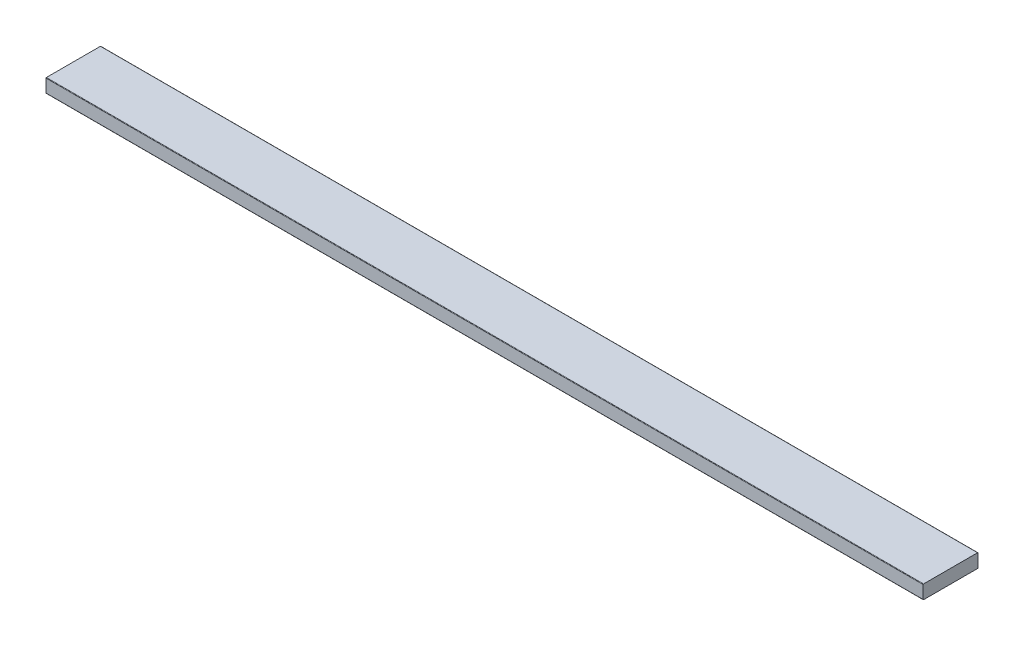
ISO-10303-21;
HEADER;
FILE_DESCRIPTION(('STEP AP214'),'2;1');
FILE_NAME('part.step','',(''),(''),'','','');
FILE_SCHEMA(('AUTOMOTIVE_DESIGN { 1 0 10303 214 1 1 1 1 }'));
ENDSEC;
DATA;
#1=APPLICATION_CONTEXT('core data for automotive mechanical design processes');
#2=APPLICATION_PROTOCOL_DEFINITION('international standard','automotive_design',2000,#1);
#3=PRODUCT_CONTEXT('',#1,'mechanical');
#4=PRODUCT('Part','Part','',(#3));
#5=PRODUCT_RELATED_PRODUCT_CATEGORY('part','',(#4));
#6=PRODUCT_DEFINITION_FORMATION('','',#4);
#7=PRODUCT_DEFINITION_CONTEXT('part definition',#1,'design');
#8=PRODUCT_DEFINITION('design','',#6,#7);
#9=PRODUCT_DEFINITION_SHAPE('','',#8);
#10=(LENGTH_UNIT() NAMED_UNIT(*) SI_UNIT(.MILLI.,.METRE.));
#11=(NAMED_UNIT(*) PLANE_ANGLE_UNIT() SI_UNIT($,.RADIAN.));
#12=(NAMED_UNIT(*) SI_UNIT($,.STERADIAN.) SOLID_ANGLE_UNIT());
#13=UNCERTAINTY_MEASURE_WITH_UNIT(LENGTH_MEASURE(1.E-05),#10,'distance_accuracy_value','');
#14=(GEOMETRIC_REPRESENTATION_CONTEXT(3) GLOBAL_UNCERTAINTY_ASSIGNED_CONTEXT((#13)) GLOBAL_UNIT_ASSIGNED_CONTEXT((#10,
#11,#12)) REPRESENTATION_CONTEXT('',''));
#15=CARTESIAN_POINT('',(0.,0.,0.));
#16=DIRECTION('',(0.,0.,1.));
#17=DIRECTION('',(1.,0.,0.));
#18=AXIS2_PLACEMENT_3D('',#15,#16,#17);
#19=CARTESIAN_POINT('',(-304.8,-4.76250000000001,-19.05));
#20=DIRECTION('',(-1.,0.,0.));
#21=DIRECTION('',(0.,0.,1.));
#22=AXIS2_PLACEMENT_3D('',#19,#20,#21);
#23=PLANE('',#22);
#24=DIRECTION('',(0.,0.,1.));
#25=VECTOR('',#24,1.);
#26=CARTESIAN_POINT('',(-304.8,-4.76250000000001,-19.05));
#27=LINE('',#26,#25);
#28=CARTESIAN_POINT('',(-304.8,-4.76250000000001,-18.735675));
#29=VERTEX_POINT('',#28);
#30=CARTESIAN_POINT('',(-304.8,-4.76250000000001,18.735675));
#31=VERTEX_POINT('',#30);
#32=EDGE_CURVE('E191',#29,#31,#27,.T.);
#33=ORIENTED_EDGE('',*,*,#32,.T.);
#34=CARTESIAN_POINT('',(-304.8,-4.44817500000001,18.735675));
#35=DIRECTION('',(-1.,0.,0.));
#36=DIRECTION('',(0.,0.,1.));
#37=AXIS2_PLACEMENT_3D('',#34,#35,#36);
#38=CIRCLE('',#37,0.314325);
#39=CARTESIAN_POINT('',(-304.8,-4.44817500000001,19.05));
#40=VERTEX_POINT('',#39);
#41=EDGE_CURVE('E169',#31,#40,#38,.T.);
#42=ORIENTED_EDGE('',*,*,#41,.T.);
#43=DIRECTION('',(0.,1.,0.));
#44=VECTOR('',#43,1.);
#45=CARTESIAN_POINT('',(-304.8,-4.76250000000001,19.05));
#46=LINE('',#45,#44);
#47=CARTESIAN_POINT('',(-304.8,4.44817499999999,19.05));
#48=VERTEX_POINT('',#47);
#49=EDGE_CURVE('E130',#40,#48,#46,.T.);
#50=ORIENTED_EDGE('',*,*,#49,.T.);
#51=CARTESIAN_POINT('',(-304.8,4.44817499999999,18.735675));
#52=DIRECTION('',(-1.,0.,0.));
#53=DIRECTION('',(0.,0.,1.));
#54=AXIS2_PLACEMENT_3D('',#51,#52,#53);
#55=CIRCLE('',#54,0.314325);
#56=CARTESIAN_POINT('',(-304.8,4.76249999999999,18.735675));
#57=VERTEX_POINT('',#56);
#58=EDGE_CURVE('E162',#48,#57,#55,.T.);
#59=ORIENTED_EDGE('',*,*,#58,.T.);
#60=DIRECTION('',(0.,0.,1.));
#61=VECTOR('',#60,1.);
#62=CARTESIAN_POINT('',(-304.8,4.76249999999999,-19.05));
#63=LINE('',#62,#61);
#64=CARTESIAN_POINT('',(-304.8,4.76249999999999,-18.735675));
#65=VERTEX_POINT('',#64);
#66=EDGE_CURVE('E186',#65,#57,#63,.T.);
#67=ORIENTED_EDGE('',*,*,#66,.F.);
#68=CARTESIAN_POINT('',(-304.8,4.44817499999999,-18.735675));
#69=DIRECTION('',(-1.,0.,0.));
#70=DIRECTION('',(0.,0.,1.));
#71=AXIS2_PLACEMENT_3D('',#68,#69,#70);
#72=CIRCLE('',#71,0.314325);
#73=CARTESIAN_POINT('',(-304.8,4.44817499999999,-19.05));
#74=VERTEX_POINT('',#73);
#75=EDGE_CURVE('E57',#65,#74,#72,.T.);
#76=ORIENTED_EDGE('',*,*,#75,.T.);
#77=DIRECTION('',(0.,1.,0.));
#78=VECTOR('',#77,1.);
#79=CARTESIAN_POINT('',(-304.8,-4.76250000000001,-19.05));
#80=LINE('',#79,#78);
#81=CARTESIAN_POINT('',(-304.8,-4.44817500000001,-19.05));
#82=VERTEX_POINT('',#81);
#83=EDGE_CURVE('E143',#82,#74,#80,.T.);
#84=ORIENTED_EDGE('',*,*,#83,.F.);
#85=CARTESIAN_POINT('',(-304.8,-4.44817500000001,-18.735675));
#86=DIRECTION('',(-1.,0.,0.));
#87=DIRECTION('',(0.,0.,1.));
#88=AXIS2_PLACEMENT_3D('',#85,#86,#87);
#89=CIRCLE('',#88,0.314325);
#90=EDGE_CURVE('E65',#82,#29,#89,.T.);
#91=ORIENTED_EDGE('',*,*,#90,.T.);
#92=EDGE_LOOP('',(#33,#42,#50,#59,#67,#76,#84,#91));
#93=FACE_BOUND('',#92,.T.);
#94=ADVANCED_FACE('F41',(#93),#23,.T.);
#95=CARTESIAN_POINT('',(-304.8,-4.76250000000001,-19.05));
#96=DIRECTION('',(0.,0.,-1.));
#97=DIRECTION('',(-1.,0.,0.));
#98=AXIS2_PLACEMENT_3D('',#95,#96,#97);
#99=PLANE('',#98);
#100=DIRECTION('',(0.,1.,0.));
#101=VECTOR('',#100,1.);
#102=CARTESIAN_POINT('',(304.8,-4.76250000000001,-19.0499999999999));
#103=LINE('',#102,#101);
#104=CARTESIAN_POINT('',(304.8,-4.44817500000001,-19.0499999999999));
#105=VERTEX_POINT('',#104);
#106=CARTESIAN_POINT('',(304.8,4.44817499999999,-19.0499999999999));
#107=VERTEX_POINT('',#106);
#108=EDGE_CURVE('E138',#105,#107,#103,.T.);
#109=ORIENTED_EDGE('',*,*,#108,.F.);
#110=DIRECTION('',(-1.,0.,0.));
#111=VECTOR('',#110,1.);
#112=CARTESIAN_POINT('',(-304.8,-4.44817500000001,-19.05));
#113=LINE('',#112,#111);
#114=EDGE_CURVE('E175',#105,#82,#113,.T.);
#115=ORIENTED_EDGE('',*,*,#114,.T.);
#116=ORIENTED_EDGE('',*,*,#83,.T.);
#117=DIRECTION('',(-1.,0.,0.));
#118=VECTOR('',#117,1.);
#119=CARTESIAN_POINT('',(-304.8,4.44817499999999,-19.05));
#120=LINE('',#119,#118);
#121=EDGE_CURVE('E172',#74,#107,#120,.F.);
#122=ORIENTED_EDGE('',*,*,#121,.T.);
#123=EDGE_LOOP('',(#109,#115,#116,#122));
#124=FACE_BOUND('',#123,.T.);
#125=ADVANCED_FACE('F204',(#124),#99,.T.);
#126=CARTESIAN_POINT('',(304.8,-4.76250000000001,-19.0499999999999));
#127=DIRECTION('',(1.,0.,0.));
#128=DIRECTION('',(0.,0.,-1.));
#129=AXIS2_PLACEMENT_3D('',#126,#127,#128);
#130=PLANE('',#129);
#131=DIRECTION('',(0.,1.,0.));
#132=VECTOR('',#131,1.);
#133=CARTESIAN_POINT('',(304.8,-4.76250000000001,19.05));
#134=LINE('',#133,#132);
#135=CARTESIAN_POINT('',(304.8,-4.44817500000001,19.05));
#136=VERTEX_POINT('',#135);
#137=CARTESIAN_POINT('',(304.8,4.44817499999999,19.05));
#138=VERTEX_POINT('',#137);
#139=EDGE_CURVE('E127',#136,#138,#134,.T.);
#140=ORIENTED_EDGE('',*,*,#139,.F.);
#141=CARTESIAN_POINT('',(304.8,-4.44817500000001,18.735675));
#142=DIRECTION('',(1.,0.,0.));
#143=DIRECTION('',(0.,0.,-1.));
#144=AXIS2_PLACEMENT_3D('',#141,#142,#143);
#145=CIRCLE('',#144,0.314325);
#146=CARTESIAN_POINT('',(304.8,-4.76250000000001,18.735675));
#147=VERTEX_POINT('',#146);
#148=EDGE_CURVE('E109',#136,#147,#145,.T.);
#149=ORIENTED_EDGE('',*,*,#148,.T.);
#150=DIRECTION('',(0.,0.,-1.));
#151=VECTOR('',#150,1.);
#152=CARTESIAN_POINT('',(304.8,-4.76250000000001,-19.0499999999999));
#153=LINE('',#152,#151);
#154=CARTESIAN_POINT('',(304.8,-4.76250000000001,-18.7356749999999));
#155=VERTEX_POINT('',#154);
#156=EDGE_CURVE('E145',#147,#155,#153,.T.);
#157=ORIENTED_EDGE('',*,*,#156,.T.);
#158=CARTESIAN_POINT('',(304.8,-4.44817500000001,-18.7356749999999));
#159=DIRECTION('',(1.,0.,0.));
#160=DIRECTION('',(0.,0.,-1.));
#161=AXIS2_PLACEMENT_3D('',#158,#159,#160);
#162=CIRCLE('',#161,0.314325);
#163=EDGE_CURVE('E121',#155,#105,#162,.T.);
#164=ORIENTED_EDGE('',*,*,#163,.T.);
#165=ORIENTED_EDGE('',*,*,#108,.T.);
#166=CARTESIAN_POINT('',(304.8,4.44817499999999,-18.7356749999999));
#167=DIRECTION('',(1.,0.,0.));
#168=DIRECTION('',(0.,0.,-1.));
#169=AXIS2_PLACEMENT_3D('',#166,#167,#168);
#170=CIRCLE('',#169,0.314325);
#171=CARTESIAN_POINT('',(304.8,4.76249999999999,-18.7356749999999));
#172=VERTEX_POINT('',#171);
#173=EDGE_CURVE('E153',#107,#172,#170,.T.);
#174=ORIENTED_EDGE('',*,*,#173,.T.);
#175=DIRECTION('',(0.,0.,-1.));
#176=VECTOR('',#175,1.);
#177=CARTESIAN_POINT('',(304.8,4.76249999999999,-19.0499999999999));
#178=LINE('',#177,#176);
#179=CARTESIAN_POINT('',(304.8,4.76249999999999,18.735675));
#180=VERTEX_POINT('',#179);
#181=EDGE_CURVE('E184',#180,#172,#178,.T.);
#182=ORIENTED_EDGE('',*,*,#181,.F.);
#183=CARTESIAN_POINT('',(304.8,4.44817499999999,18.735675));
#184=DIRECTION('',(1.,0.,0.));
#185=DIRECTION('',(0.,0.,-1.));
#186=AXIS2_PLACEMENT_3D('',#183,#184,#185);
#187=CIRCLE('',#186,0.314325);
#188=EDGE_CURVE('E132',#180,#138,#187,.T.);
#189=ORIENTED_EDGE('',*,*,#188,.T.);
#190=EDGE_LOOP('',(#140,#149,#157,#164,#165,#174,#182,#189));
#191=FACE_BOUND('',#190,.T.);
#192=ADVANCED_FACE('F135',(#191),#130,.T.);
#193=CARTESIAN_POINT('',(-304.8,-4.76250000000001,19.05));
#194=DIRECTION('',(0.,0.,1.));
#195=DIRECTION('',(1.,0.,0.));
#196=AXIS2_PLACEMENT_3D('',#193,#194,#195);
#197=PLANE('',#196);
#198=ORIENTED_EDGE('',*,*,#49,.F.);
#199=DIRECTION('',(1.,0.,0.));
#200=VECTOR('',#199,1.);
#201=CARTESIAN_POINT('',(304.8,-4.44817500000001,19.05));
#202=LINE('',#201,#200);
#203=EDGE_CURVE('E113',#40,#136,#202,.T.);
#204=ORIENTED_EDGE('',*,*,#203,.T.);
#205=ORIENTED_EDGE('',*,*,#139,.T.);
#206=DIRECTION('',(1.,0.,0.));
#207=VECTOR('',#206,1.);
#208=CARTESIAN_POINT('',(-304.8,4.44817499999999,19.05));
#209=LINE('',#208,#207);
#210=EDGE_CURVE('E133',#138,#48,#209,.F.);
#211=ORIENTED_EDGE('',*,*,#210,.T.);
#212=EDGE_LOOP('',(#198,#204,#205,#211));
#213=FACE_BOUND('',#212,.T.);
#214=ADVANCED_FACE('F126',(#213),#197,.T.);
#215=CARTESIAN_POINT('',(0.,-4.76250000000001,0.));
#216=DIRECTION('',(0.,1.,0.));
#217=DIRECTION('',(0.,0.,1.));
#218=AXIS2_PLACEMENT_3D('',#215,#216,#217);
#219=PLANE('',#218);
#220=ORIENTED_EDGE('',*,*,#156,.F.);
#221=DIRECTION('',(1.,0.,0.));
#222=VECTOR('',#221,1.);
#223=CARTESIAN_POINT('',(-304.8,-4.76250000000001,18.735675));
#224=LINE('',#223,#222);
#225=EDGE_CURVE('E114',#147,#31,#224,.F.);
#226=ORIENTED_EDGE('',*,*,#225,.T.);
#227=ORIENTED_EDGE('',*,*,#32,.F.);
#228=DIRECTION('',(-1.,0.,0.));
#229=VECTOR('',#228,1.);
#230=CARTESIAN_POINT('',(304.8,-4.76250000000001,-18.7356749999999));
#231=LINE('',#230,#229);
#232=EDGE_CURVE('E120',#29,#155,#231,.F.);
#233=ORIENTED_EDGE('',*,*,#232,.T.);
#234=EDGE_LOOP('',(#220,#226,#227,#233));
#235=FACE_BOUND('',#234,.T.);
#236=ADVANCED_FACE('F228',(#235),#219,.F.);
#237=CARTESIAN_POINT('',(0.,4.76249999999999,0.));
#238=DIRECTION('',(0.,1.,0.));
#239=DIRECTION('',(0.,0.,1.));
#240=AXIS2_PLACEMENT_3D('',#237,#238,#239);
#241=PLANE('',#240);
#242=ORIENTED_EDGE('',*,*,#181,.T.);
#243=DIRECTION('',(-1.,0.,0.));
#244=VECTOR('',#243,1.);
#245=CARTESIAN_POINT('',(0.,4.76249999999999,-18.735675));
#246=LINE('',#245,#244);
#247=EDGE_CURVE('E11',#172,#65,#246,.T.);
#248=ORIENTED_EDGE('',*,*,#247,.T.);
#249=ORIENTED_EDGE('',*,*,#66,.T.);
#250=DIRECTION('',(1.,0.,0.));
#251=VECTOR('',#250,1.);
#252=CARTESIAN_POINT('',(0.,4.76249999999999,18.735675));
#253=LINE('',#252,#251);
#254=EDGE_CURVE('E50',#57,#180,#253,.T.);
#255=ORIENTED_EDGE('',*,*,#254,.T.);
#256=EDGE_LOOP('',(#242,#248,#249,#255));
#257=FACE_BOUND('',#256,.T.);
#258=ADVANCED_FACE('F183',(#257),#241,.T.);
#259=CARTESIAN_POINT('',(-304.8,-4.44817500000001,18.735675));
#260=DIRECTION('',(-1.,0.,0.));
#261=DIRECTION('',(0.,0.,1.));
#262=AXIS2_PLACEMENT_3D('',#259,#260,#261);
#263=CYLINDRICAL_SURFACE('',#262,0.314325);
#264=ORIENTED_EDGE('',*,*,#41,.F.);
#265=ORIENTED_EDGE('',*,*,#225,.F.);
#266=ORIENTED_EDGE('',*,*,#148,.F.);
#267=ORIENTED_EDGE('',*,*,#203,.F.);
#268=EDGE_LOOP('',(#264,#265,#266,#267));
#269=FACE_BOUND('',#268,.T.);
#270=ADVANCED_FACE('F112',(#269),#263,.T.);
#271=CARTESIAN_POINT('',(-304.8,-4.44817500000001,-18.735675));
#272=DIRECTION('',(1.,0.,0.));
#273=DIRECTION('',(0.,0.,-1.));
#274=AXIS2_PLACEMENT_3D('',#271,#272,#273);
#275=CYLINDRICAL_SURFACE('',#274,0.314325);
#276=ORIENTED_EDGE('',*,*,#163,.F.);
#277=ORIENTED_EDGE('',*,*,#232,.F.);
#278=ORIENTED_EDGE('',*,*,#90,.F.);
#279=ORIENTED_EDGE('',*,*,#114,.F.);
#280=EDGE_LOOP('',(#276,#277,#278,#279));
#281=FACE_BOUND('',#280,.T.);
#282=ADVANCED_FACE('F211',(#281),#275,.T.);
#283=CARTESIAN_POINT('',(0.,4.44817499999999,-18.735675));
#284=DIRECTION('',(-1.,0.,0.));
#285=DIRECTION('',(0.,0.,1.));
#286=AXIS2_PLACEMENT_3D('',#283,#284,#285);
#287=CYLINDRICAL_SURFACE('',#286,0.314325);
#288=ORIENTED_EDGE('',*,*,#173,.F.);
#289=ORIENTED_EDGE('',*,*,#121,.F.);
#290=ORIENTED_EDGE('',*,*,#75,.F.);
#291=ORIENTED_EDGE('',*,*,#247,.F.);
#292=EDGE_LOOP('',(#288,#289,#290,#291));
#293=FACE_BOUND('',#292,.T.);
#294=ADVANCED_FACE('F206',(#293),#287,.T.);
#295=CARTESIAN_POINT('',(0.,4.44817499999999,18.735675));
#296=DIRECTION('',(1.,0.,0.));
#297=DIRECTION('',(0.,0.,-1.));
#298=AXIS2_PLACEMENT_3D('',#295,#296,#297);
#299=CYLINDRICAL_SURFACE('',#298,0.314325);
#300=ORIENTED_EDGE('',*,*,#58,.F.);
#301=ORIENTED_EDGE('',*,*,#210,.F.);
#302=ORIENTED_EDGE('',*,*,#188,.F.);
#303=ORIENTED_EDGE('',*,*,#254,.F.);
#304=EDGE_LOOP('',(#300,#301,#302,#303));
#305=FACE_BOUND('',#304,.T.);
#306=ADVANCED_FACE('F43',(#305),#299,.T.);
#307=CLOSED_SHELL('',(#94,#125,#192,#214,#236,#258,#270,#282,#294,#306));
#308=MANIFOLD_SOLID_BREP('B2',#307);
#309=ADVANCED_BREP_SHAPE_REPRESENTATION('',(#18,#308),#14);
#310=SHAPE_DEFINITION_REPRESENTATION(#9,#309);
ENDSEC;
END-ISO-10303-21;
